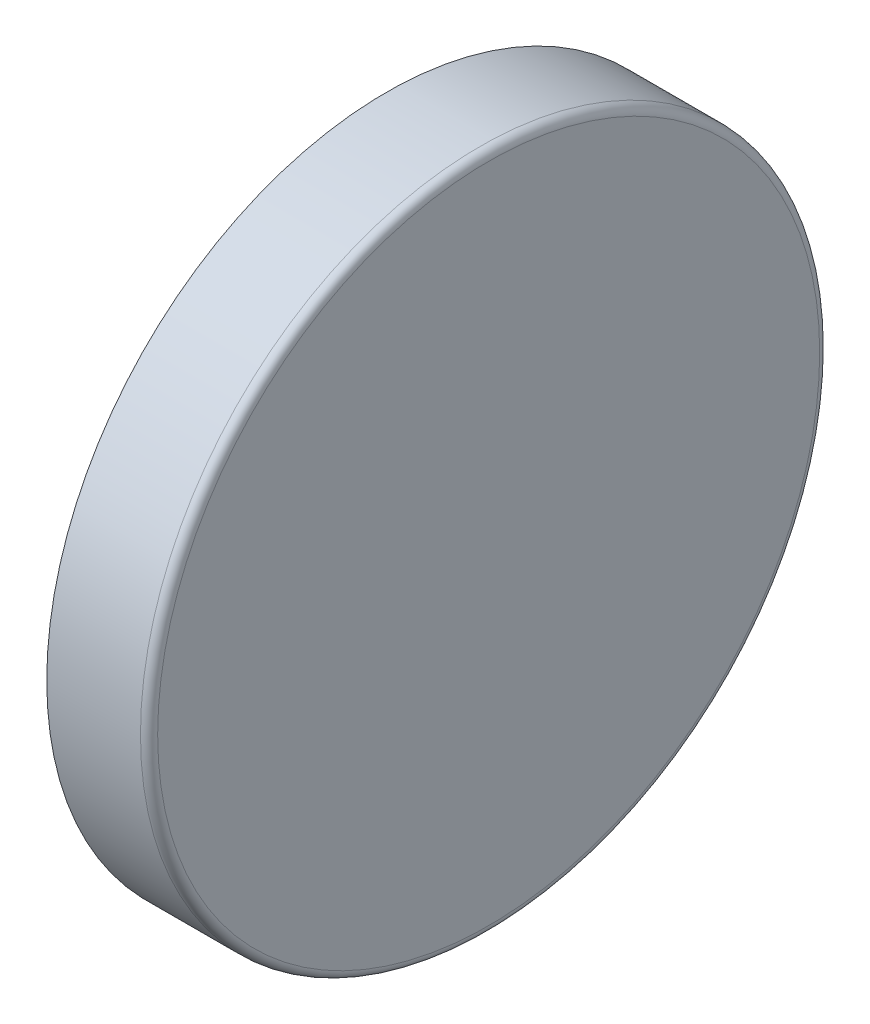
ISO-10303-21;
HEADER;
FILE_DESCRIPTION(('STEP AP214'),'2;1');
FILE_NAME('part.step','',(''),(''),'','','');
FILE_SCHEMA(('AUTOMOTIVE_DESIGN { 1 0 10303 214 1 1 1 1 }'));
ENDSEC;
DATA;
#1=APPLICATION_CONTEXT('core data for automotive mechanical design processes');
#2=APPLICATION_PROTOCOL_DEFINITION('international standard','automotive_design',2000,#1);
#3=PRODUCT_CONTEXT('',#1,'mechanical');
#4=PRODUCT('Part','Part','',(#3));
#5=PRODUCT_RELATED_PRODUCT_CATEGORY('part','',(#4));
#6=PRODUCT_DEFINITION_FORMATION('','',#4);
#7=PRODUCT_DEFINITION_CONTEXT('part definition',#1,'design');
#8=PRODUCT_DEFINITION('design','',#6,#7);
#9=PRODUCT_DEFINITION_SHAPE('','',#8);
#10=(LENGTH_UNIT() NAMED_UNIT(*) SI_UNIT(.MILLI.,.METRE.));
#11=(NAMED_UNIT(*) PLANE_ANGLE_UNIT() SI_UNIT($,.RADIAN.));
#12=(NAMED_UNIT(*) SI_UNIT($,.STERADIAN.) SOLID_ANGLE_UNIT());
#13=UNCERTAINTY_MEASURE_WITH_UNIT(LENGTH_MEASURE(1.E-05),#10,'distance_accuracy_value','');
#14=(GEOMETRIC_REPRESENTATION_CONTEXT(3) GLOBAL_UNCERTAINTY_ASSIGNED_CONTEXT((#13)) GLOBAL_UNIT_ASSIGNED_CONTEXT((#10,
#11,#12)) REPRESENTATION_CONTEXT('',''));
#15=CARTESIAN_POINT('',(0.,0.,0.));
#16=DIRECTION('',(0.,0.,1.));
#17=DIRECTION('',(1.,0.,0.));
#18=AXIS2_PLACEMENT_3D('',#15,#16,#17);
#19=CARTESIAN_POINT('',(79.72,0.,0.));
#20=DIRECTION('',(1.,0.,0.));
#21=DIRECTION('',(0.,0.,-1.));
#22=AXIS2_PLACEMENT_3D('',#19,#20,#21);
#23=PLANE('',#22);
#24=CARTESIAN_POINT('',(79.7199999999,0.,0.));
#25=DIRECTION('',(-1.,0.,0.));
#26=DIRECTION('',(0.,0.,-1.));
#27=AXIS2_PLACEMENT_3D('',#24,#25,#26);
#28=CIRCLE('',#27,7.6999999999);
#29=CARTESIAN_POINT('',(79.71999999994,0.,-7.69999999993));
#30=VERTEX_POINT('',#29);
#31=CARTESIAN_POINT('',(79.71999999994,0.,7.69999999997));
#32=VERTEX_POINT('',#31);
#33=EDGE_CURVE('E34',#30,#32,#28,.T.);
#34=ORIENTED_EDGE('',*,*,#33,.F.);
#35=CARTESIAN_POINT('',(79.7199999999,0.,0.));
#36=DIRECTION('',(-1.,0.,0.));
#37=DIRECTION('',(0.,0.,1.));
#38=AXIS2_PLACEMENT_3D('',#35,#36,#37);
#39=CIRCLE('',#38,7.7);
#40=EDGE_CURVE('E40',#32,#30,#39,.T.);
#41=ORIENTED_EDGE('',*,*,#40,.F.);
#42=EDGE_LOOP('',(#34,#41));
#43=FACE_BOUND('',#42,.T.);
#44=ADVANCED_FACE('F17',(#43),#23,.T.);
#45=CARTESIAN_POINT('',(79.5199999999,0.,0.));
#46=DIRECTION('',(-1.,0.,0.));
#47=DIRECTION('',(0.,0.,-1.));
#48=AXIS2_PLACEMENT_3D('',#45,#46,#47);
#49=TOROIDAL_SURFACE('',#48,7.6999999999,0.200000000000003);
#50=ORIENTED_EDGE('',*,*,#33,.T.);
#51=ORIENTED_EDGE('',*,*,#40,.T.);
#52=EDGE_LOOP('',(#50,#51));
#53=FACE_BOUND('',#52,.T.);
#54=CARTESIAN_POINT('',(79.52,0.,0.));
#55=DIRECTION('',(1.,0.,0.));
#56=DIRECTION('',(0.,0.,-1.));
#57=AXIS2_PLACEMENT_3D('',#54,#55,#56);
#58=CIRCLE('',#57,7.9);
#59=CARTESIAN_POINT('',(79.52,0.,-7.9));
#60=VERTEX_POINT('',#59);
#61=EDGE_CURVE('E27',#60,#60,#58,.F.);
#62=ORIENTED_EDGE('',*,*,#61,.F.);
#63=EDGE_LOOP('',(#62));
#64=FACE_BOUND('',#63,.T.);
#65=ADVANCED_FACE('F38',(#53,#64),#49,.T.);
#66=CARTESIAN_POINT('',(78.53,0.,0.));
#67=DIRECTION('',(1.,0.,0.));
#68=DIRECTION('',(0.,0.,-1.));
#69=AXIS2_PLACEMENT_3D('',#66,#67,#68);
#70=CYLINDRICAL_SURFACE('',#69,7.9);
#71=CARTESIAN_POINT('',(77.34,0.,0.));
#72=DIRECTION('',(1.,0.,0.));
#73=DIRECTION('',(0.,0.,-1.));
#74=AXIS2_PLACEMENT_3D('',#71,#72,#73);
#75=CIRCLE('',#74,7.9);
#76=CARTESIAN_POINT('',(77.34,0.,-7.9));
#77=VERTEX_POINT('',#76);
#78=EDGE_CURVE('E11',#77,#77,#75,.F.);
#79=ORIENTED_EDGE('',*,*,#78,.F.);
#80=EDGE_LOOP('',(#79));
#81=FACE_BOUND('',#80,.T.);
#82=ORIENTED_EDGE('',*,*,#61,.T.);
#83=EDGE_LOOP('',(#82));
#84=FACE_BOUND('',#83,.T.);
#85=ADVANCED_FACE('F67',(#81,#84),#70,.T.);
#86=CARTESIAN_POINT('',(77.34,0.,0.));
#87=DIRECTION('',(-1.,0.,0.));
#88=DIRECTION('',(0.,0.,1.));
#89=AXIS2_PLACEMENT_3D('',#86,#87,#88);
#90=PLANE('',#89);
#91=ORIENTED_EDGE('',*,*,#78,.T.);
#92=EDGE_LOOP('',(#91));
#93=FACE_BOUND('',#92,.T.);
#94=ADVANCED_FACE('F72',(#93),#90,.T.);
#95=CLOSED_SHELL('',(#44,#65,#85,#94));
#96=MANIFOLD_SOLID_BREP('B1',#95);
#97=ADVANCED_BREP_SHAPE_REPRESENTATION('',(#18,#96),#14);
#98=SHAPE_DEFINITION_REPRESENTATION(#9,#97);
ENDSEC;
END-ISO-10303-21;
